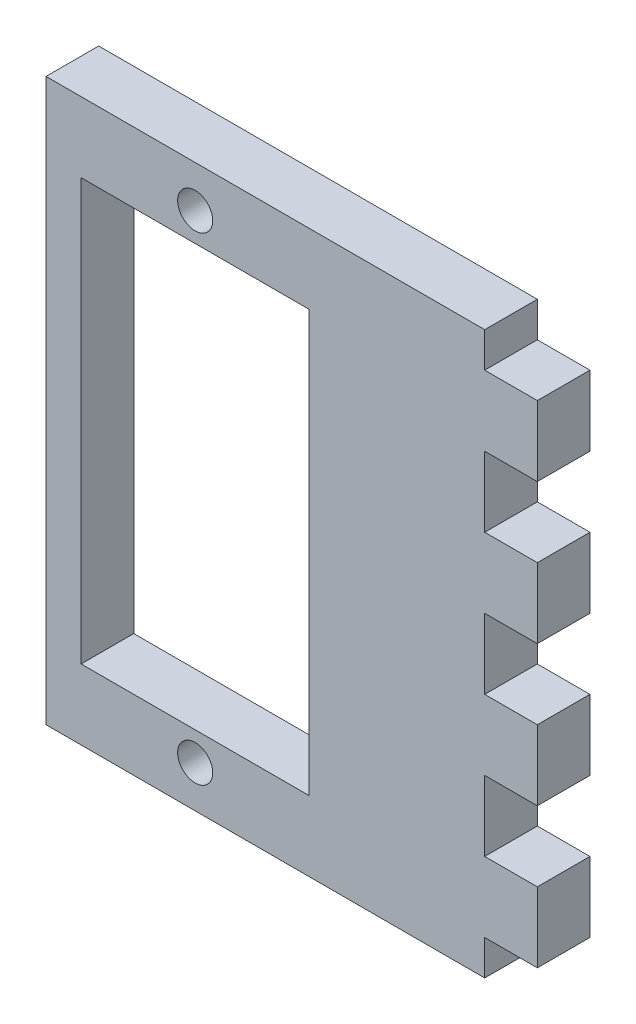
ISO-10303-21;
HEADER;
FILE_DESCRIPTION(('STEP AP214'),'2;1');
FILE_NAME('part.step','',(''),(''),'','','');
FILE_SCHEMA(('AUTOMOTIVE_DESIGN { 1 0 10303 214 1 1 1 1 }'));
ENDSEC;
DATA;
#1=APPLICATION_CONTEXT('core data for automotive mechanical design processes');
#2=APPLICATION_PROTOCOL_DEFINITION('international standard','automotive_design',2000,#1);
#3=PRODUCT_CONTEXT('',#1,'mechanical');
#4=PRODUCT('Part','Part','',(#3));
#5=PRODUCT_RELATED_PRODUCT_CATEGORY('part','',(#4));
#6=PRODUCT_DEFINITION_FORMATION('','',#4);
#7=PRODUCT_DEFINITION_CONTEXT('part definition',#1,'design');
#8=PRODUCT_DEFINITION('design','',#6,#7);
#9=PRODUCT_DEFINITION_SHAPE('','',#8);
#10=(LENGTH_UNIT() NAMED_UNIT(*) SI_UNIT(.MILLI.,.METRE.));
#11=(NAMED_UNIT(*) PLANE_ANGLE_UNIT() SI_UNIT($,.RADIAN.));
#12=(NAMED_UNIT(*) SI_UNIT($,.STERADIAN.) SOLID_ANGLE_UNIT());
#13=UNCERTAINTY_MEASURE_WITH_UNIT(LENGTH_MEASURE(1.E-05),#10,'distance_accuracy_value','');
#14=(GEOMETRIC_REPRESENTATION_CONTEXT(3) GLOBAL_UNCERTAINTY_ASSIGNED_CONTEXT((#13)) GLOBAL_UNIT_ASSIGNED_CONTEXT((#10,
#11,#12)) REPRESENTATION_CONTEXT('',''));
#15=CARTESIAN_POINT('',(0.,0.,0.));
#16=DIRECTION('',(0.,0.,1.));
#17=DIRECTION('',(1.,0.,0.));
#18=AXIS2_PLACEMENT_3D('',#15,#16,#17);
#19=CARTESIAN_POINT('',(0.,0.,3.));
#20=DIRECTION('',(0.,0.,-1.));
#21=DIRECTION('',(-1.,0.,0.));
#22=AXIS2_PLACEMENT_3D('',#19,#20,#21);
#23=PLANE('',#22);
#24=CARTESIAN_POINT('',(0.,13.625,3.));
#25=DIRECTION('',(0.,0.,1.));
#26=DIRECTION('',(1.,0.,0.));
#27=AXIS2_PLACEMENT_3D('',#24,#25,#26);
#28=CIRCLE('',#27,1.);
#29=CARTESIAN_POINT('',(1.,13.625,3.));
#30=VERTEX_POINT('',#29);
#31=EDGE_CURVE('E223',#30,#30,#28,.T.);
#32=ORIENTED_EDGE('',*,*,#31,.F.);
#33=EDGE_LOOP('',(#32));
#34=FACE_BOUND('',#33,.T.);
#35=DIRECTION('',(0.,1.,0.));
#36=VECTOR('',#35,1.);
#37=CARTESIAN_POINT('',(16.5,14.,3.));
#38=LINE('',#37,#36);
#39=CARTESIAN_POINT('',(16.5,14.,3.));
#40=VERTEX_POINT('',#39);
#41=CARTESIAN_POINT('',(16.5,16.,3.));
#42=VERTEX_POINT('',#41);
#43=EDGE_CURVE('E233',#40,#42,#38,.T.);
#44=ORIENTED_EDGE('',*,*,#43,.T.);
#45=DIRECTION('',(-1.,0.,0.));
#46=VECTOR('',#45,1.);
#47=CARTESIAN_POINT('',(-8.5,16.,3.));
#48=LINE('',#47,#46);
#49=CARTESIAN_POINT('',(-8.5,16.,3.));
#50=VERTEX_POINT('',#49);
#51=EDGE_CURVE('E236',#42,#50,#48,.T.);
#52=ORIENTED_EDGE('',*,*,#51,.T.);
#53=DIRECTION('',(0.,-1.,0.));
#54=VECTOR('',#53,1.);
#55=CARTESIAN_POINT('',(-8.5,-16.,3.));
#56=LINE('',#55,#54);
#57=CARTESIAN_POINT('',(-8.5,-16.,3.));
#58=VERTEX_POINT('',#57);
#59=EDGE_CURVE('E239',#50,#58,#56,.T.);
#60=ORIENTED_EDGE('',*,*,#59,.T.);
#61=DIRECTION('',(1.,0.,0.));
#62=VECTOR('',#61,1.);
#63=CARTESIAN_POINT('',(-8.5,-16.,3.));
#64=LINE('',#63,#62);
#65=CARTESIAN_POINT('',(16.5,-16.,3.));
#66=VERTEX_POINT('',#65);
#67=EDGE_CURVE('E241',#58,#66,#64,.T.);
#68=ORIENTED_EDGE('',*,*,#67,.T.);
#69=DIRECTION('',(0.,1.,0.));
#70=VECTOR('',#69,1.);
#71=CARTESIAN_POINT('',(16.5,-16.,3.));
#72=LINE('',#71,#70);
#73=CARTESIAN_POINT('',(16.5,-14.,3.));
#74=VERTEX_POINT('',#73);
#75=EDGE_CURVE('E243',#66,#74,#72,.T.);
#76=ORIENTED_EDGE('',*,*,#75,.T.);
#77=DIRECTION('',(1.,0.,0.));
#78=VECTOR('',#77,1.);
#79=CARTESIAN_POINT('',(16.5,-14.,3.));
#80=LINE('',#79,#78);
#81=CARTESIAN_POINT('',(19.5,-14.,3.));
#82=VERTEX_POINT('',#81);
#83=EDGE_CURVE('E245',#74,#82,#80,.T.);
#84=ORIENTED_EDGE('',*,*,#83,.T.);
#85=DIRECTION('',(0.,1.,0.));
#86=VECTOR('',#85,1.);
#87=CARTESIAN_POINT('',(19.5,-14.,3.));
#88=LINE('',#87,#86);
#89=CARTESIAN_POINT('',(19.5,-10.,3.));
#90=VERTEX_POINT('',#89);
#91=EDGE_CURVE('E247',#82,#90,#88,.T.);
#92=ORIENTED_EDGE('',*,*,#91,.T.);
#93=DIRECTION('',(-1.,0.,0.));
#94=VECTOR('',#93,1.);
#95=CARTESIAN_POINT('',(19.5,-10.,3.));
#96=LINE('',#95,#94);
#97=CARTESIAN_POINT('',(16.5,-10.,3.));
#98=VERTEX_POINT('',#97);
#99=EDGE_CURVE('E249',#90,#98,#96,.T.);
#100=ORIENTED_EDGE('',*,*,#99,.T.);
#101=DIRECTION('',(0.,1.,0.));
#102=VECTOR('',#101,1.);
#103=CARTESIAN_POINT('',(16.5,-10.,3.));
#104=LINE('',#103,#102);
#105=CARTESIAN_POINT('',(16.5,-6.,3.));
#106=VERTEX_POINT('',#105);
#107=EDGE_CURVE('E251',#98,#106,#104,.T.);
#108=ORIENTED_EDGE('',*,*,#107,.T.);
#109=DIRECTION('',(1.,0.,0.));
#110=VECTOR('',#109,1.);
#111=CARTESIAN_POINT('',(16.5,-6.,3.));
#112=LINE('',#111,#110);
#113=CARTESIAN_POINT('',(19.5,-6.,3.));
#114=VERTEX_POINT('',#113);
#115=EDGE_CURVE('E253',#106,#114,#112,.T.);
#116=ORIENTED_EDGE('',*,*,#115,.T.);
#117=DIRECTION('',(0.,1.,0.));
#118=VECTOR('',#117,1.);
#119=CARTESIAN_POINT('',(19.5,-6.,3.));
#120=LINE('',#119,#118);
#121=CARTESIAN_POINT('',(19.5,-2.,3.));
#122=VERTEX_POINT('',#121);
#123=EDGE_CURVE('E255',#114,#122,#120,.T.);
#124=ORIENTED_EDGE('',*,*,#123,.T.);
#125=DIRECTION('',(-1.,0.,0.));
#126=VECTOR('',#125,1.);
#127=CARTESIAN_POINT('',(19.5,-2.,3.));
#128=LINE('',#127,#126);
#129=CARTESIAN_POINT('',(16.5,-2.,3.));
#130=VERTEX_POINT('',#129);
#131=EDGE_CURVE('E257',#122,#130,#128,.T.);
#132=ORIENTED_EDGE('',*,*,#131,.T.);
#133=DIRECTION('',(0.,1.,0.));
#134=VECTOR('',#133,1.);
#135=CARTESIAN_POINT('',(16.5,-2.,3.));
#136=LINE('',#135,#134);
#137=CARTESIAN_POINT('',(16.5,2.,3.));
#138=VERTEX_POINT('',#137);
#139=EDGE_CURVE('E259',#130,#138,#136,.T.);
#140=ORIENTED_EDGE('',*,*,#139,.T.);
#141=DIRECTION('',(1.,0.,0.));
#142=VECTOR('',#141,1.);
#143=CARTESIAN_POINT('',(19.5,2.,3.));
#144=LINE('',#143,#142);
#145=CARTESIAN_POINT('',(19.5,2.,3.));
#146=VERTEX_POINT('',#145);
#147=EDGE_CURVE('E261',#138,#146,#144,.T.);
#148=ORIENTED_EDGE('',*,*,#147,.T.);
#149=DIRECTION('',(0.,1.,0.));
#150=VECTOR('',#149,1.);
#151=CARTESIAN_POINT('',(19.5,6.,3.));
#152=LINE('',#151,#150);
#153=CARTESIAN_POINT('',(19.5,6.,3.));
#154=VERTEX_POINT('',#153);
#155=EDGE_CURVE('E263',#146,#154,#152,.T.);
#156=ORIENTED_EDGE('',*,*,#155,.T.);
#157=DIRECTION('',(-1.,0.,0.));
#158=VECTOR('',#157,1.);
#159=CARTESIAN_POINT('',(16.5,6.,3.));
#160=LINE('',#159,#158);
#161=CARTESIAN_POINT('',(16.5,6.,3.));
#162=VERTEX_POINT('',#161);
#163=EDGE_CURVE('E265',#154,#162,#160,.T.);
#164=ORIENTED_EDGE('',*,*,#163,.T.);
#165=DIRECTION('',(0.,1.,0.));
#166=VECTOR('',#165,1.);
#167=CARTESIAN_POINT('',(16.5,6.,3.));
#168=LINE('',#167,#166);
#169=CARTESIAN_POINT('',(16.5,10.,3.));
#170=VERTEX_POINT('',#169);
#171=EDGE_CURVE('E267',#162,#170,#168,.T.);
#172=ORIENTED_EDGE('',*,*,#171,.T.);
#173=DIRECTION('',(1.,0.,0.));
#174=VECTOR('',#173,1.);
#175=CARTESIAN_POINT('',(19.5,10.,3.));
#176=LINE('',#175,#174);
#177=CARTESIAN_POINT('',(19.5,10.,3.));
#178=VERTEX_POINT('',#177);
#179=EDGE_CURVE('E269',#170,#178,#176,.T.);
#180=ORIENTED_EDGE('',*,*,#179,.T.);
#181=DIRECTION('',(0.,1.,0.));
#182=VECTOR('',#181,1.);
#183=CARTESIAN_POINT('',(19.5,14.,3.));
#184=LINE('',#183,#182);
#185=CARTESIAN_POINT('',(19.5,14.,3.));
#186=VERTEX_POINT('',#185);
#187=EDGE_CURVE('E271',#178,#186,#184,.T.);
#188=ORIENTED_EDGE('',*,*,#187,.T.);
#189=DIRECTION('',(-1.,0.,0.));
#190=VECTOR('',#189,1.);
#191=CARTESIAN_POINT('',(16.5,14.,3.));
#192=LINE('',#191,#190);
#193=EDGE_CURVE('E273',#186,#40,#192,.T.);
#194=ORIENTED_EDGE('',*,*,#193,.T.);
#195=EDGE_LOOP('',(#44,#52,#60,#68,#76,#84,#92,#100,#108,#116,#124,#132,#140,#148,#156,#164,
#172,#180,#188,#194));
#196=FACE_BOUND('',#195,.T.);
#197=DIRECTION('',(0.,-1.,0.));
#198=VECTOR('',#197,1.);
#199=CARTESIAN_POINT('',(-6.5,-12.,3.));
#200=LINE('',#199,#198);
#201=CARTESIAN_POINT('',(-6.5,12.,3.));
#202=VERTEX_POINT('',#201);
#203=CARTESIAN_POINT('',(-6.5,-12.,3.));
#204=VERTEX_POINT('',#203);
#205=EDGE_CURVE('E194',#202,#204,#200,.T.);
#206=ORIENTED_EDGE('',*,*,#205,.F.);
#207=DIRECTION('',(-1.,0.,0.));
#208=VECTOR('',#207,1.);
#209=CARTESIAN_POINT('',(6.5,12.,3.));
#210=LINE('',#209,#208);
#211=CARTESIAN_POINT('',(6.5,12.,3.));
#212=VERTEX_POINT('',#211);
#213=EDGE_CURVE('E217',#212,#202,#210,.T.);
#214=ORIENTED_EDGE('',*,*,#213,.F.);
#215=DIRECTION('',(0.,1.,0.));
#216=VECTOR('',#215,1.);
#217=CARTESIAN_POINT('',(6.5,-12.,3.));
#218=LINE('',#217,#216);
#219=CARTESIAN_POINT('',(6.5,-12.,3.));
#220=VERTEX_POINT('',#219);
#221=EDGE_CURVE('E215',#220,#212,#218,.T.);
#222=ORIENTED_EDGE('',*,*,#221,.F.);
#223=DIRECTION('',(1.,0.,0.));
#224=VECTOR('',#223,1.);
#225=CARTESIAN_POINT('',(6.5,-12.,3.));
#226=LINE('',#225,#224);
#227=EDGE_CURVE('E202',#204,#220,#226,.T.);
#228=ORIENTED_EDGE('',*,*,#227,.F.);
#229=EDGE_LOOP('',(#206,#214,#222,#228));
#230=FACE_BOUND('',#229,.T.);
#231=CARTESIAN_POINT('',(0.,-13.625,3.));
#232=DIRECTION('',(0.,0.,1.));
#233=DIRECTION('',(-1.,0.,0.));
#234=AXIS2_PLACEMENT_3D('',#231,#232,#233);
#235=CIRCLE('',#234,1.);
#236=CARTESIAN_POINT('',(-1.,-13.625,3.));
#237=VERTEX_POINT('',#236);
#238=EDGE_CURVE('E704',#237,#237,#235,.T.);
#239=ORIENTED_EDGE('',*,*,#238,.F.);
#240=EDGE_LOOP('',(#239));
#241=FACE_BOUND('',#240,.T.);
#242=ADVANCED_FACE('F33',(#34,#196,#230,#241),#23,.F.);
#243=CARTESIAN_POINT('',(0.,0.,0.));
#244=DIRECTION('',(0.,0.,-1.));
#245=DIRECTION('',(-1.,0.,0.));
#246=AXIS2_PLACEMENT_3D('',#243,#244,#245);
#247=PLANE('',#246);
#248=CARTESIAN_POINT('',(0.,13.625,0.));
#249=DIRECTION('',(0.,0.,1.));
#250=DIRECTION('',(1.,0.,0.));
#251=AXIS2_PLACEMENT_3D('',#248,#249,#250);
#252=CIRCLE('',#251,1.);
#253=CARTESIAN_POINT('',(1.,13.625,0.));
#254=VERTEX_POINT('',#253);
#255=EDGE_CURVE('E710',#254,#254,#252,.T.);
#256=ORIENTED_EDGE('',*,*,#255,.T.);
#257=EDGE_LOOP('',(#256));
#258=FACE_BOUND('',#257,.T.);
#259=DIRECTION('',(0.,1.,0.));
#260=VECTOR('',#259,1.);
#261=CARTESIAN_POINT('',(16.5,14.,0.));
#262=LINE('',#261,#260);
#263=CARTESIAN_POINT('',(16.5,14.,0.));
#264=VERTEX_POINT('',#263);
#265=CARTESIAN_POINT('',(16.5,16.,0.));
#266=VERTEX_POINT('',#265);
#267=EDGE_CURVE('E210',#264,#266,#262,.T.);
#268=ORIENTED_EDGE('',*,*,#267,.F.);
#269=DIRECTION('',(-1.,0.,0.));
#270=VECTOR('',#269,1.);
#271=CARTESIAN_POINT('',(16.5,14.,0.));
#272=LINE('',#271,#270);
#273=CARTESIAN_POINT('',(19.5,14.,0.));
#274=VERTEX_POINT('',#273);
#275=EDGE_CURVE('E237',#274,#264,#272,.T.);
#276=ORIENTED_EDGE('',*,*,#275,.F.);
#277=DIRECTION('',(0.,1.,0.));
#278=VECTOR('',#277,1.);
#279=CARTESIAN_POINT('',(19.5,14.,0.));
#280=LINE('',#279,#278);
#281=CARTESIAN_POINT('',(19.5,10.,0.));
#282=VERTEX_POINT('',#281);
#283=EDGE_CURVE('E312',#282,#274,#280,.T.);
#284=ORIENTED_EDGE('',*,*,#283,.F.);
#285=DIRECTION('',(1.,0.,0.));
#286=VECTOR('',#285,1.);
#287=CARTESIAN_POINT('',(19.5,10.,0.));
#288=LINE('',#287,#286);
#289=CARTESIAN_POINT('',(16.5,10.,0.));
#290=VERTEX_POINT('',#289);
#291=EDGE_CURVE('E310',#290,#282,#288,.T.);
#292=ORIENTED_EDGE('',*,*,#291,.F.);
#293=DIRECTION('',(0.,1.,0.));
#294=VECTOR('',#293,1.);
#295=CARTESIAN_POINT('',(16.5,6.,0.));
#296=LINE('',#295,#294);
#297=CARTESIAN_POINT('',(16.5,6.,0.));
#298=VERTEX_POINT('',#297);
#299=EDGE_CURVE('E308',#298,#290,#296,.T.);
#300=ORIENTED_EDGE('',*,*,#299,.F.);
#301=DIRECTION('',(-1.,0.,0.));
#302=VECTOR('',#301,1.);
#303=CARTESIAN_POINT('',(16.5,6.,0.));
#304=LINE('',#303,#302);
#305=CARTESIAN_POINT('',(19.5,6.,0.));
#306=VERTEX_POINT('',#305);
#307=EDGE_CURVE('E306',#306,#298,#304,.T.);
#308=ORIENTED_EDGE('',*,*,#307,.F.);
#309=DIRECTION('',(0.,1.,0.));
#310=VECTOR('',#309,1.);
#311=CARTESIAN_POINT('',(19.5,6.,0.));
#312=LINE('',#311,#310);
#313=CARTESIAN_POINT('',(19.5,2.,0.));
#314=VERTEX_POINT('',#313);
#315=EDGE_CURVE('E304',#314,#306,#312,.T.);
#316=ORIENTED_EDGE('',*,*,#315,.F.);
#317=DIRECTION('',(1.,0.,0.));
#318=VECTOR('',#317,1.);
#319=CARTESIAN_POINT('',(19.5,2.,0.));
#320=LINE('',#319,#318);
#321=CARTESIAN_POINT('',(16.5,2.,0.));
#322=VERTEX_POINT('',#321);
#323=EDGE_CURVE('E302',#322,#314,#320,.T.);
#324=ORIENTED_EDGE('',*,*,#323,.F.);
#325=DIRECTION('',(0.,1.,0.));
#326=VECTOR('',#325,1.);
#327=CARTESIAN_POINT('',(16.5,-2.,0.));
#328=LINE('',#327,#326);
#329=CARTESIAN_POINT('',(16.5,-2.,0.));
#330=VERTEX_POINT('',#329);
#331=EDGE_CURVE('E300',#330,#322,#328,.T.);
#332=ORIENTED_EDGE('',*,*,#331,.F.);
#333=DIRECTION('',(-1.,0.,0.));
#334=VECTOR('',#333,1.);
#335=CARTESIAN_POINT('',(19.5,-2.,0.));
#336=LINE('',#335,#334);
#337=CARTESIAN_POINT('',(19.5,-2.,0.));
#338=VERTEX_POINT('',#337);
#339=EDGE_CURVE('E298',#338,#330,#336,.T.);
#340=ORIENTED_EDGE('',*,*,#339,.F.);
#341=DIRECTION('',(0.,1.,0.));
#342=VECTOR('',#341,1.);
#343=CARTESIAN_POINT('',(19.5,-6.,0.));
#344=LINE('',#343,#342);
#345=CARTESIAN_POINT('',(19.5,-6.,0.));
#346=VERTEX_POINT('',#345);
#347=EDGE_CURVE('E296',#346,#338,#344,.T.);
#348=ORIENTED_EDGE('',*,*,#347,.F.);
#349=DIRECTION('',(1.,0.,0.));
#350=VECTOR('',#349,1.);
#351=CARTESIAN_POINT('',(16.5,-6.,0.));
#352=LINE('',#351,#350);
#353=CARTESIAN_POINT('',(16.5,-6.,0.));
#354=VERTEX_POINT('',#353);
#355=EDGE_CURVE('E294',#354,#346,#352,.T.);
#356=ORIENTED_EDGE('',*,*,#355,.F.);
#357=DIRECTION('',(0.,1.,0.));
#358=VECTOR('',#357,1.);
#359=CARTESIAN_POINT('',(16.5,-10.,0.));
#360=LINE('',#359,#358);
#361=CARTESIAN_POINT('',(16.5,-10.,0.));
#362=VERTEX_POINT('',#361);
#363=EDGE_CURVE('E292',#362,#354,#360,.T.);
#364=ORIENTED_EDGE('',*,*,#363,.F.);
#365=DIRECTION('',(-1.,0.,0.));
#366=VECTOR('',#365,1.);
#367=CARTESIAN_POINT('',(19.5,-10.,0.));
#368=LINE('',#367,#366);
#369=CARTESIAN_POINT('',(19.5,-10.,0.));
#370=VERTEX_POINT('',#369);
#371=EDGE_CURVE('E290',#370,#362,#368,.T.);
#372=ORIENTED_EDGE('',*,*,#371,.F.);
#373=DIRECTION('',(0.,1.,0.));
#374=VECTOR('',#373,1.);
#375=CARTESIAN_POINT('',(19.5,-14.,0.));
#376=LINE('',#375,#374);
#377=CARTESIAN_POINT('',(19.5,-14.,0.));
#378=VERTEX_POINT('',#377);
#379=EDGE_CURVE('E288',#378,#370,#376,.T.);
#380=ORIENTED_EDGE('',*,*,#379,.F.);
#381=DIRECTION('',(1.,0.,0.));
#382=VECTOR('',#381,1.);
#383=CARTESIAN_POINT('',(16.5,-14.,0.));
#384=LINE('',#383,#382);
#385=CARTESIAN_POINT('',(16.5,-14.,0.));
#386=VERTEX_POINT('',#385);
#387=EDGE_CURVE('E286',#386,#378,#384,.T.);
#388=ORIENTED_EDGE('',*,*,#387,.F.);
#389=DIRECTION('',(0.,1.,0.));
#390=VECTOR('',#389,1.);
#391=CARTESIAN_POINT('',(16.5,-16.,0.));
#392=LINE('',#391,#390);
#393=CARTESIAN_POINT('',(16.5,-16.,0.));
#394=VERTEX_POINT('',#393);
#395=EDGE_CURVE('E284',#394,#386,#392,.T.);
#396=ORIENTED_EDGE('',*,*,#395,.F.);
#397=DIRECTION('',(1.,0.,0.));
#398=VECTOR('',#397,1.);
#399=CARTESIAN_POINT('',(-8.5,-16.,0.));
#400=LINE('',#399,#398);
#401=CARTESIAN_POINT('',(-8.5,-16.,0.));
#402=VERTEX_POINT('',#401);
#403=EDGE_CURVE('E282',#402,#394,#400,.T.);
#404=ORIENTED_EDGE('',*,*,#403,.F.);
#405=DIRECTION('',(0.,-1.,0.));
#406=VECTOR('',#405,1.);
#407=CARTESIAN_POINT('',(-8.5,-16.,0.));
#408=LINE('',#407,#406);
#409=CARTESIAN_POINT('',(-8.5,16.,0.));
#410=VERTEX_POINT('',#409);
#411=EDGE_CURVE('E280',#410,#402,#408,.T.);
#412=ORIENTED_EDGE('',*,*,#411,.F.);
#413=DIRECTION('',(-1.,0.,0.));
#414=VECTOR('',#413,1.);
#415=CARTESIAN_POINT('',(-8.5,16.,0.));
#416=LINE('',#415,#414);
#417=EDGE_CURVE('E278',#266,#410,#416,.T.);
#418=ORIENTED_EDGE('',*,*,#417,.F.);
#419=EDGE_LOOP('',(#268,#276,#284,#292,#300,#308,#316,#324,#332,#340,#348,#356,#364,#372,#380,
#388,#396,#404,#412,#418));
#420=FACE_BOUND('',#419,.T.);
#421=DIRECTION('',(-1.,0.,0.));
#422=VECTOR('',#421,1.);
#423=CARTESIAN_POINT('',(6.5,12.,0.));
#424=LINE('',#423,#422);
#425=CARTESIAN_POINT('',(6.5,12.,0.));
#426=VERTEX_POINT('',#425);
#427=CARTESIAN_POINT('',(-6.5,12.,0.));
#428=VERTEX_POINT('',#427);
#429=EDGE_CURVE('E203',#426,#428,#424,.T.);
#430=ORIENTED_EDGE('',*,*,#429,.T.);
#431=DIRECTION('',(0.,-1.,0.));
#432=VECTOR('',#431,1.);
#433=CARTESIAN_POINT('',(-6.5,-12.,0.));
#434=LINE('',#433,#432);
#435=CARTESIAN_POINT('',(-6.5,-12.,0.));
#436=VERTEX_POINT('',#435);
#437=EDGE_CURVE('E56',#428,#436,#434,.T.);
#438=ORIENTED_EDGE('',*,*,#437,.T.);
#439=DIRECTION('',(1.,0.,0.));
#440=VECTOR('',#439,1.);
#441=CARTESIAN_POINT('',(6.5,-12.,0.));
#442=LINE('',#441,#440);
#443=CARTESIAN_POINT('',(6.5,-12.,0.));
#444=VERTEX_POINT('',#443);
#445=EDGE_CURVE('E209',#436,#444,#442,.T.);
#446=ORIENTED_EDGE('',*,*,#445,.T.);
#447=DIRECTION('',(0.,1.,0.));
#448=VECTOR('',#447,1.);
#449=CARTESIAN_POINT('',(6.5,-12.,0.));
#450=LINE('',#449,#448);
#451=EDGE_CURVE('E225',#444,#426,#450,.T.);
#452=ORIENTED_EDGE('',*,*,#451,.T.);
#453=EDGE_LOOP('',(#430,#438,#446,#452));
#454=FACE_BOUND('',#453,.T.);
#455=CARTESIAN_POINT('',(0.,-13.625,0.));
#456=DIRECTION('',(0.,0.,1.));
#457=DIRECTION('',(-1.,0.,0.));
#458=AXIS2_PLACEMENT_3D('',#455,#456,#457);
#459=CIRCLE('',#458,1.);
#460=CARTESIAN_POINT('',(-1.,-13.625,0.));
#461=VERTEX_POINT('',#460);
#462=EDGE_CURVE('E707',#461,#461,#459,.T.);
#463=ORIENTED_EDGE('',*,*,#462,.T.);
#464=EDGE_LOOP('',(#463));
#465=FACE_BOUND('',#464,.T.);
#466=ADVANCED_FACE('F378',(#258,#420,#454,#465),#247,.T.);
#467=CARTESIAN_POINT('',(16.5,14.,3.));
#468=DIRECTION('',(-1.,0.,0.));
#469=DIRECTION('',(0.,0.,1.));
#470=AXIS2_PLACEMENT_3D('',#467,#468,#469);
#471=PLANE('',#470);
#472=ORIENTED_EDGE('',*,*,#267,.T.);
#473=DIRECTION('',(0.,0.,-1.));
#474=VECTOR('',#473,1.);
#475=CARTESIAN_POINT('',(16.5,16.,3.));
#476=LINE('',#475,#474);
#477=EDGE_CURVE('E11',#42,#266,#476,.T.);
#478=ORIENTED_EDGE('',*,*,#477,.F.);
#479=ORIENTED_EDGE('',*,*,#43,.F.);
#480=DIRECTION('',(0.,0.,-1.));
#481=VECTOR('',#480,1.);
#482=CARTESIAN_POINT('',(16.5,14.,3.));
#483=LINE('',#482,#481);
#484=EDGE_CURVE('E275',#40,#264,#483,.T.);
#485=ORIENTED_EDGE('',*,*,#484,.T.);
#486=EDGE_LOOP('',(#472,#478,#479,#485));
#487=FACE_BOUND('',#486,.T.);
#488=ADVANCED_FACE('F35',(#487),#471,.F.);
#489=CARTESIAN_POINT('',(-8.5,16.,3.));
#490=DIRECTION('',(0.,-1.,0.));
#491=DIRECTION('',(0.,0.,-1.));
#492=AXIS2_PLACEMENT_3D('',#489,#490,#491);
#493=PLANE('',#492);
#494=ORIENTED_EDGE('',*,*,#417,.T.);
#495=DIRECTION('',(0.,0.,-1.));
#496=VECTOR('',#495,1.);
#497=CARTESIAN_POINT('',(-8.5,16.,3.));
#498=LINE('',#497,#496);
#499=EDGE_CURVE('E41',#50,#410,#498,.T.);
#500=ORIENTED_EDGE('',*,*,#499,.F.);
#501=ORIENTED_EDGE('',*,*,#51,.F.);
#502=ORIENTED_EDGE('',*,*,#477,.T.);
#503=EDGE_LOOP('',(#494,#500,#501,#502));
#504=FACE_BOUND('',#503,.T.);
#505=ADVANCED_FACE('F395',(#504),#493,.F.);
#506=CARTESIAN_POINT('',(-8.5,-16.,3.));
#507=DIRECTION('',(1.,0.,0.));
#508=DIRECTION('',(0.,0.,-1.));
#509=AXIS2_PLACEMENT_3D('',#506,#507,#508);
#510=PLANE('',#509);
#511=ORIENTED_EDGE('',*,*,#411,.T.);
#512=DIRECTION('',(0.,0.,-1.));
#513=VECTOR('',#512,1.);
#514=CARTESIAN_POINT('',(-8.5,-16.,3.));
#515=LINE('',#514,#513);
#516=EDGE_CURVE('E365',#58,#402,#515,.T.);
#517=ORIENTED_EDGE('',*,*,#516,.F.);
#518=ORIENTED_EDGE('',*,*,#59,.F.);
#519=ORIENTED_EDGE('',*,*,#499,.T.);
#520=EDGE_LOOP('',(#511,#517,#518,#519));
#521=FACE_BOUND('',#520,.T.);
#522=ADVANCED_FACE('F372',(#521),#510,.F.);
#523=CARTESIAN_POINT('',(-8.5,-16.,3.));
#524=DIRECTION('',(0.,1.,0.));
#525=DIRECTION('',(0.,0.,1.));
#526=AXIS2_PLACEMENT_3D('',#523,#524,#525);
#527=PLANE('',#526);
#528=ORIENTED_EDGE('',*,*,#403,.T.);
#529=DIRECTION('',(0.,0.,-1.));
#530=VECTOR('',#529,1.);
#531=CARTESIAN_POINT('',(16.5,-16.,3.));
#532=LINE('',#531,#530);
#533=EDGE_CURVE('E362',#66,#394,#532,.T.);
#534=ORIENTED_EDGE('',*,*,#533,.F.);
#535=ORIENTED_EDGE('',*,*,#67,.F.);
#536=ORIENTED_EDGE('',*,*,#516,.T.);
#537=EDGE_LOOP('',(#528,#534,#535,#536));
#538=FACE_BOUND('',#537,.T.);
#539=ADVANCED_FACE('F384',(#538),#527,.F.);
#540=CARTESIAN_POINT('',(16.5,-16.,3.));
#541=DIRECTION('',(-1.,0.,0.));
#542=DIRECTION('',(0.,0.,1.));
#543=AXIS2_PLACEMENT_3D('',#540,#541,#542);
#544=PLANE('',#543);
#545=ORIENTED_EDGE('',*,*,#395,.T.);
#546=DIRECTION('',(0.,0.,-1.));
#547=VECTOR('',#546,1.);
#548=CARTESIAN_POINT('',(16.5,-14.,3.));
#549=LINE('',#548,#547);
#550=EDGE_CURVE('E359',#74,#386,#549,.T.);
#551=ORIENTED_EDGE('',*,*,#550,.F.);
#552=ORIENTED_EDGE('',*,*,#75,.F.);
#553=ORIENTED_EDGE('',*,*,#533,.T.);
#554=EDGE_LOOP('',(#545,#551,#552,#553));
#555=FACE_BOUND('',#554,.T.);
#556=ADVANCED_FACE('F388',(#555),#544,.F.);
#557=CARTESIAN_POINT('',(16.5,-14.,3.));
#558=DIRECTION('',(0.,1.,0.));
#559=DIRECTION('',(0.,0.,1.));
#560=AXIS2_PLACEMENT_3D('',#557,#558,#559);
#561=PLANE('',#560);
#562=ORIENTED_EDGE('',*,*,#387,.T.);
#563=DIRECTION('',(0.,0.,-1.));
#564=VECTOR('',#563,1.);
#565=CARTESIAN_POINT('',(19.5,-14.,3.));
#566=LINE('',#565,#564);
#567=EDGE_CURVE('E356',#82,#378,#566,.T.);
#568=ORIENTED_EDGE('',*,*,#567,.F.);
#569=ORIENTED_EDGE('',*,*,#83,.F.);
#570=ORIENTED_EDGE('',*,*,#550,.T.);
#571=EDGE_LOOP('',(#562,#568,#569,#570));
#572=FACE_BOUND('',#571,.T.);
#573=ADVANCED_FACE('F468',(#572),#561,.F.);
#574=CARTESIAN_POINT('',(19.5,-14.,3.));
#575=DIRECTION('',(-1.,0.,0.));
#576=DIRECTION('',(0.,0.,1.));
#577=AXIS2_PLACEMENT_3D('',#574,#575,#576);
#578=PLANE('',#577);
#579=ORIENTED_EDGE('',*,*,#379,.T.);
#580=DIRECTION('',(0.,0.,-1.));
#581=VECTOR('',#580,1.);
#582=CARTESIAN_POINT('',(19.5,-10.,3.));
#583=LINE('',#582,#581);
#584=EDGE_CURVE('E353',#90,#370,#583,.T.);
#585=ORIENTED_EDGE('',*,*,#584,.F.);
#586=ORIENTED_EDGE('',*,*,#91,.F.);
#587=ORIENTED_EDGE('',*,*,#567,.T.);
#588=EDGE_LOOP('',(#579,#585,#586,#587));
#589=FACE_BOUND('',#588,.T.);
#590=ADVANCED_FACE('F466',(#589),#578,.F.);
#591=CARTESIAN_POINT('',(19.5,-10.,3.));
#592=DIRECTION('',(0.,-1.,0.));
#593=DIRECTION('',(0.,0.,-1.));
#594=AXIS2_PLACEMENT_3D('',#591,#592,#593);
#595=PLANE('',#594);
#596=ORIENTED_EDGE('',*,*,#371,.T.);
#597=DIRECTION('',(0.,0.,-1.));
#598=VECTOR('',#597,1.);
#599=CARTESIAN_POINT('',(16.5,-10.,3.));
#600=LINE('',#599,#598);
#601=EDGE_CURVE('E350',#98,#362,#600,.T.);
#602=ORIENTED_EDGE('',*,*,#601,.F.);
#603=ORIENTED_EDGE('',*,*,#99,.F.);
#604=ORIENTED_EDGE('',*,*,#584,.T.);
#605=EDGE_LOOP('',(#596,#602,#603,#604));
#606=FACE_BOUND('',#605,.T.);
#607=ADVANCED_FACE('F461',(#606),#595,.F.);
#608=CARTESIAN_POINT('',(16.5,-10.,3.));
#609=DIRECTION('',(-1.,0.,0.));
#610=DIRECTION('',(0.,0.,1.));
#611=AXIS2_PLACEMENT_3D('',#608,#609,#610);
#612=PLANE('',#611);
#613=ORIENTED_EDGE('',*,*,#363,.T.);
#614=DIRECTION('',(0.,0.,-1.));
#615=VECTOR('',#614,1.);
#616=CARTESIAN_POINT('',(16.5,-6.,3.));
#617=LINE('',#616,#615);
#618=EDGE_CURVE('E347',#106,#354,#617,.T.);
#619=ORIENTED_EDGE('',*,*,#618,.F.);
#620=ORIENTED_EDGE('',*,*,#107,.F.);
#621=ORIENTED_EDGE('',*,*,#601,.T.);
#622=EDGE_LOOP('',(#613,#619,#620,#621));
#623=FACE_BOUND('',#622,.T.);
#624=ADVANCED_FACE('F456',(#623),#612,.F.);
#625=CARTESIAN_POINT('',(16.5,-6.,3.));
#626=DIRECTION('',(0.,1.,0.));
#627=DIRECTION('',(0.,0.,1.));
#628=AXIS2_PLACEMENT_3D('',#625,#626,#627);
#629=PLANE('',#628);
#630=ORIENTED_EDGE('',*,*,#355,.T.);
#631=DIRECTION('',(0.,0.,-1.));
#632=VECTOR('',#631,1.);
#633=CARTESIAN_POINT('',(19.5,-6.,3.));
#634=LINE('',#633,#632);
#635=EDGE_CURVE('E344',#114,#346,#634,.T.);
#636=ORIENTED_EDGE('',*,*,#635,.F.);
#637=ORIENTED_EDGE('',*,*,#115,.F.);
#638=ORIENTED_EDGE('',*,*,#618,.T.);
#639=EDGE_LOOP('',(#630,#636,#637,#638));
#640=FACE_BOUND('',#639,.T.);
#641=ADVANCED_FACE('F452',(#640),#629,.F.);
#642=CARTESIAN_POINT('',(19.5,-6.,3.));
#643=DIRECTION('',(-1.,0.,0.));
#644=DIRECTION('',(0.,0.,1.));
#645=AXIS2_PLACEMENT_3D('',#642,#643,#644);
#646=PLANE('',#645);
#647=ORIENTED_EDGE('',*,*,#347,.T.);
#648=DIRECTION('',(0.,0.,-1.));
#649=VECTOR('',#648,1.);
#650=CARTESIAN_POINT('',(19.5,-2.,3.));
#651=LINE('',#650,#649);
#652=EDGE_CURVE('E341',#122,#338,#651,.T.);
#653=ORIENTED_EDGE('',*,*,#652,.F.);
#654=ORIENTED_EDGE('',*,*,#123,.F.);
#655=ORIENTED_EDGE('',*,*,#635,.T.);
#656=EDGE_LOOP('',(#647,#653,#654,#655));
#657=FACE_BOUND('',#656,.T.);
#658=ADVANCED_FACE('F447',(#657),#646,.F.);
#659=CARTESIAN_POINT('',(19.5,-2.,3.));
#660=DIRECTION('',(0.,-1.,0.));
#661=DIRECTION('',(1.,0.,0.));
#662=AXIS2_PLACEMENT_3D('',#659,#660,#661);
#663=PLANE('',#662);
#664=ORIENTED_EDGE('',*,*,#339,.T.);
#665=DIRECTION('',(0.,0.,-1.));
#666=VECTOR('',#665,1.);
#667=CARTESIAN_POINT('',(16.5,-2.,3.));
#668=LINE('',#667,#666);
#669=EDGE_CURVE('E338',#130,#330,#668,.T.);
#670=ORIENTED_EDGE('',*,*,#669,.F.);
#671=ORIENTED_EDGE('',*,*,#131,.F.);
#672=ORIENTED_EDGE('',*,*,#652,.T.);
#673=EDGE_LOOP('',(#664,#670,#671,#672));
#674=FACE_BOUND('',#673,.T.);
#675=ADVANCED_FACE('F441',(#674),#663,.F.);
#676=CARTESIAN_POINT('',(16.5,-2.,3.));
#677=DIRECTION('',(-1.,0.,0.));
#678=DIRECTION('',(0.,0.,1.));
#679=AXIS2_PLACEMENT_3D('',#676,#677,#678);
#680=PLANE('',#679);
#681=ORIENTED_EDGE('',*,*,#331,.T.);
#682=DIRECTION('',(0.,0.,-1.));
#683=VECTOR('',#682,1.);
#684=CARTESIAN_POINT('',(16.5,2.,3.));
#685=LINE('',#684,#683);
#686=EDGE_CURVE('E335',#138,#322,#685,.T.);
#687=ORIENTED_EDGE('',*,*,#686,.F.);
#688=ORIENTED_EDGE('',*,*,#139,.F.);
#689=ORIENTED_EDGE('',*,*,#669,.T.);
#690=EDGE_LOOP('',(#681,#687,#688,#689));
#691=FACE_BOUND('',#690,.T.);
#692=ADVANCED_FACE('F437',(#691),#680,.F.);
#693=CARTESIAN_POINT('',(19.5,2.,3.));
#694=DIRECTION('',(0.,1.,0.));
#695=DIRECTION('',(-1.,0.,0.));
#696=AXIS2_PLACEMENT_3D('',#693,#694,#695);
#697=PLANE('',#696);
#698=ORIENTED_EDGE('',*,*,#323,.T.);
#699=DIRECTION('',(0.,0.,-1.));
#700=VECTOR('',#699,1.);
#701=CARTESIAN_POINT('',(19.5,2.,3.));
#702=LINE('',#701,#700);
#703=EDGE_CURVE('E332',#146,#314,#702,.T.);
#704=ORIENTED_EDGE('',*,*,#703,.F.);
#705=ORIENTED_EDGE('',*,*,#147,.F.);
#706=ORIENTED_EDGE('',*,*,#686,.T.);
#707=EDGE_LOOP('',(#698,#704,#705,#706));
#708=FACE_BOUND('',#707,.T.);
#709=ADVANCED_FACE('F432',(#708),#697,.F.);
#710=CARTESIAN_POINT('',(19.5,6.,3.));
#711=DIRECTION('',(-1.,0.,0.));
#712=DIRECTION('',(0.,0.,1.));
#713=AXIS2_PLACEMENT_3D('',#710,#711,#712);
#714=PLANE('',#713);
#715=ORIENTED_EDGE('',*,*,#315,.T.);
#716=DIRECTION('',(0.,0.,-1.));
#717=VECTOR('',#716,1.);
#718=CARTESIAN_POINT('',(19.5,6.,3.));
#719=LINE('',#718,#717);
#720=EDGE_CURVE('E329',#154,#306,#719,.T.);
#721=ORIENTED_EDGE('',*,*,#720,.F.);
#722=ORIENTED_EDGE('',*,*,#155,.F.);
#723=ORIENTED_EDGE('',*,*,#703,.T.);
#724=EDGE_LOOP('',(#715,#721,#722,#723));
#725=FACE_BOUND('',#724,.T.);
#726=ADVANCED_FACE('F426',(#725),#714,.F.);
#727=CARTESIAN_POINT('',(16.5,6.,3.));
#728=DIRECTION('',(0.,-1.,0.));
#729=DIRECTION('',(0.,0.,-1.));
#730=AXIS2_PLACEMENT_3D('',#727,#728,#729);
#731=PLANE('',#730);
#732=ORIENTED_EDGE('',*,*,#307,.T.);
#733=DIRECTION('',(0.,0.,-1.));
#734=VECTOR('',#733,1.);
#735=CARTESIAN_POINT('',(16.5,6.,3.));
#736=LINE('',#735,#734);
#737=EDGE_CURVE('E326',#162,#298,#736,.T.);
#738=ORIENTED_EDGE('',*,*,#737,.F.);
#739=ORIENTED_EDGE('',*,*,#163,.F.);
#740=ORIENTED_EDGE('',*,*,#720,.T.);
#741=EDGE_LOOP('',(#732,#738,#739,#740));
#742=FACE_BOUND('',#741,.T.);
#743=ADVANCED_FACE('F422',(#742),#731,.F.);
#744=CARTESIAN_POINT('',(16.5,6.,3.));
#745=DIRECTION('',(-1.,0.,0.));
#746=DIRECTION('',(0.,0.,1.));
#747=AXIS2_PLACEMENT_3D('',#744,#745,#746);
#748=PLANE('',#747);
#749=ORIENTED_EDGE('',*,*,#299,.T.);
#750=DIRECTION('',(0.,0.,-1.));
#751=VECTOR('',#750,1.);
#752=CARTESIAN_POINT('',(16.5,10.,3.));
#753=LINE('',#752,#751);
#754=EDGE_CURVE('E323',#170,#290,#753,.T.);
#755=ORIENTED_EDGE('',*,*,#754,.F.);
#756=ORIENTED_EDGE('',*,*,#171,.F.);
#757=ORIENTED_EDGE('',*,*,#737,.T.);
#758=EDGE_LOOP('',(#749,#755,#756,#757));
#759=FACE_BOUND('',#758,.T.);
#760=ADVANCED_FACE('F417',(#759),#748,.F.);
#761=CARTESIAN_POINT('',(19.5,10.,3.));
#762=DIRECTION('',(0.,1.,0.));
#763=DIRECTION('',(0.,0.,1.));
#764=AXIS2_PLACEMENT_3D('',#761,#762,#763);
#765=PLANE('',#764);
#766=ORIENTED_EDGE('',*,*,#291,.T.);
#767=DIRECTION('',(0.,0.,-1.));
#768=VECTOR('',#767,1.);
#769=CARTESIAN_POINT('',(19.5,10.,3.));
#770=LINE('',#769,#768);
#771=EDGE_CURVE('E320',#178,#282,#770,.T.);
#772=ORIENTED_EDGE('',*,*,#771,.F.);
#773=ORIENTED_EDGE('',*,*,#179,.F.);
#774=ORIENTED_EDGE('',*,*,#754,.T.);
#775=EDGE_LOOP('',(#766,#772,#773,#774));
#776=FACE_BOUND('',#775,.T.);
#777=ADVANCED_FACE('F411',(#776),#765,.F.);
#778=CARTESIAN_POINT('',(19.5,14.,3.));
#779=DIRECTION('',(-1.,0.,0.));
#780=DIRECTION('',(0.,0.,1.));
#781=AXIS2_PLACEMENT_3D('',#778,#779,#780);
#782=PLANE('',#781);
#783=ORIENTED_EDGE('',*,*,#283,.T.);
#784=DIRECTION('',(0.,0.,-1.));
#785=VECTOR('',#784,1.);
#786=CARTESIAN_POINT('',(19.5,14.,3.));
#787=LINE('',#786,#785);
#788=EDGE_CURVE('E317',#186,#274,#787,.T.);
#789=ORIENTED_EDGE('',*,*,#788,.F.);
#790=ORIENTED_EDGE('',*,*,#187,.F.);
#791=ORIENTED_EDGE('',*,*,#771,.T.);
#792=EDGE_LOOP('',(#783,#789,#790,#791));
#793=FACE_BOUND('',#792,.T.);
#794=ADVANCED_FACE('F407',(#793),#782,.F.);
#795=CARTESIAN_POINT('',(16.5,14.,3.));
#796=DIRECTION('',(0.,-1.,0.));
#797=DIRECTION('',(0.,0.,-1.));
#798=AXIS2_PLACEMENT_3D('',#795,#796,#797);
#799=PLANE('',#798);
#800=ORIENTED_EDGE('',*,*,#275,.T.);
#801=ORIENTED_EDGE('',*,*,#484,.F.);
#802=ORIENTED_EDGE('',*,*,#193,.F.);
#803=ORIENTED_EDGE('',*,*,#788,.T.);
#804=EDGE_LOOP('',(#800,#801,#802,#803));
#805=FACE_BOUND('',#804,.T.);
#806=ADVANCED_FACE('F402',(#805),#799,.F.);
#807=CARTESIAN_POINT('',(-6.5,-12.,3.));
#808=DIRECTION('',(1.,0.,0.));
#809=DIRECTION('',(0.,0.,-1.));
#810=AXIS2_PLACEMENT_3D('',#807,#808,#809);
#811=PLANE('',#810);
#812=ORIENTED_EDGE('',*,*,#437,.F.);
#813=DIRECTION('',(0.,0.,-1.));
#814=VECTOR('',#813,1.);
#815=CARTESIAN_POINT('',(-6.5,12.,3.));
#816=LINE('',#815,#814);
#817=EDGE_CURVE('E198',#202,#428,#816,.T.);
#818=ORIENTED_EDGE('',*,*,#817,.F.);
#819=ORIENTED_EDGE('',*,*,#205,.T.);
#820=DIRECTION('',(0.,0.,-1.));
#821=VECTOR('',#820,1.);
#822=CARTESIAN_POINT('',(-6.5,-12.,3.));
#823=LINE('',#822,#821);
#824=EDGE_CURVE('E197',#204,#436,#823,.T.);
#825=ORIENTED_EDGE('',*,*,#824,.T.);
#826=EDGE_LOOP('',(#812,#818,#819,#825));
#827=FACE_BOUND('',#826,.T.);
#828=ADVANCED_FACE('F196',(#827),#811,.T.);
#829=CARTESIAN_POINT('',(6.5,-12.,3.));
#830=DIRECTION('',(0.,1.,0.));
#831=DIRECTION('',(0.,0.,1.));
#832=AXIS2_PLACEMENT_3D('',#829,#830,#831);
#833=PLANE('',#832);
#834=ORIENTED_EDGE('',*,*,#445,.F.);
#835=ORIENTED_EDGE('',*,*,#824,.F.);
#836=ORIENTED_EDGE('',*,*,#227,.T.);
#837=DIRECTION('',(0.,0.,-1.));
#838=VECTOR('',#837,1.);
#839=CARTESIAN_POINT('',(6.5,-12.,3.));
#840=LINE('',#839,#838);
#841=EDGE_CURVE('E211',#220,#444,#840,.T.);
#842=ORIENTED_EDGE('',*,*,#841,.T.);
#843=EDGE_LOOP('',(#834,#835,#836,#842));
#844=FACE_BOUND('',#843,.T.);
#845=ADVANCED_FACE('F206',(#844),#833,.T.);
#846=CARTESIAN_POINT('',(6.5,-12.,3.));
#847=DIRECTION('',(-1.,0.,0.));
#848=DIRECTION('',(0.,0.,1.));
#849=AXIS2_PLACEMENT_3D('',#846,#847,#848);
#850=PLANE('',#849);
#851=ORIENTED_EDGE('',*,*,#451,.F.);
#852=ORIENTED_EDGE('',*,*,#841,.F.);
#853=ORIENTED_EDGE('',*,*,#221,.T.);
#854=DIRECTION('',(0.,0.,-1.));
#855=VECTOR('',#854,1.);
#856=CARTESIAN_POINT('',(6.5,12.,3.));
#857=LINE('',#856,#855);
#858=EDGE_CURVE('E48',#212,#426,#857,.T.);
#859=ORIENTED_EDGE('',*,*,#858,.T.);
#860=EDGE_LOOP('',(#851,#852,#853,#859));
#861=FACE_BOUND('',#860,.T.);
#862=ADVANCED_FACE('F577',(#861),#850,.T.);
#863=CARTESIAN_POINT('',(6.5,12.,3.));
#864=DIRECTION('',(0.,-1.,0.));
#865=DIRECTION('',(1.,0.,0.));
#866=AXIS2_PLACEMENT_3D('',#863,#864,#865);
#867=PLANE('',#866);
#868=ORIENTED_EDGE('',*,*,#429,.F.);
#869=ORIENTED_EDGE('',*,*,#858,.F.);
#870=ORIENTED_EDGE('',*,*,#213,.T.);
#871=ORIENTED_EDGE('',*,*,#817,.T.);
#872=EDGE_LOOP('',(#868,#869,#870,#871));
#873=FACE_BOUND('',#872,.T.);
#874=ADVANCED_FACE('F583',(#873),#867,.T.);
#875=CARTESIAN_POINT('',(0.,13.625,3.));
#876=DIRECTION('',(0.,0.,-1.));
#877=DIRECTION('',(-1.,0.,0.));
#878=AXIS2_PLACEMENT_3D('',#875,#876,#877);
#879=CYLINDRICAL_SURFACE('',#878,1.);
#880=ORIENTED_EDGE('',*,*,#31,.T.);
#881=EDGE_LOOP('',(#880));
#882=FACE_BOUND('',#881,.T.);
#883=ORIENTED_EDGE('',*,*,#255,.F.);
#884=EDGE_LOOP('',(#883));
#885=FACE_BOUND('',#884,.T.);
#886=ADVANCED_FACE('F591',(#882,#885),#879,.F.);
#887=CARTESIAN_POINT('',(0.,-13.625,3.));
#888=DIRECTION('',(0.,0.,-1.));
#889=DIRECTION('',(-1.,0.,0.));
#890=AXIS2_PLACEMENT_3D('',#887,#888,#889);
#891=CYLINDRICAL_SURFACE('',#890,1.);
#892=ORIENTED_EDGE('',*,*,#238,.T.);
#893=EDGE_LOOP('',(#892));
#894=FACE_BOUND('',#893,.T.);
#895=ORIENTED_EDGE('',*,*,#462,.F.);
#896=EDGE_LOOP('',(#895));
#897=FACE_BOUND('',#896,.T.);
#898=ADVANCED_FACE('F598',(#894,#897),#891,.F.);
#899=CLOSED_SHELL('',(#242,#466,#488,#505,#522,#539,#556,#573,#590,#607,#624,#641,#658,#675,
#692,#709,#726,#743,#760,#777,#794,#806,#828,#845,#862,#874,#886,#898));
#900=MANIFOLD_SOLID_BREP('B2',#899);
#901=ADVANCED_BREP_SHAPE_REPRESENTATION('',(#18,#900),#14);
#902=SHAPE_DEFINITION_REPRESENTATION(#9,#901);
ENDSEC;
END-ISO-10303-21;
